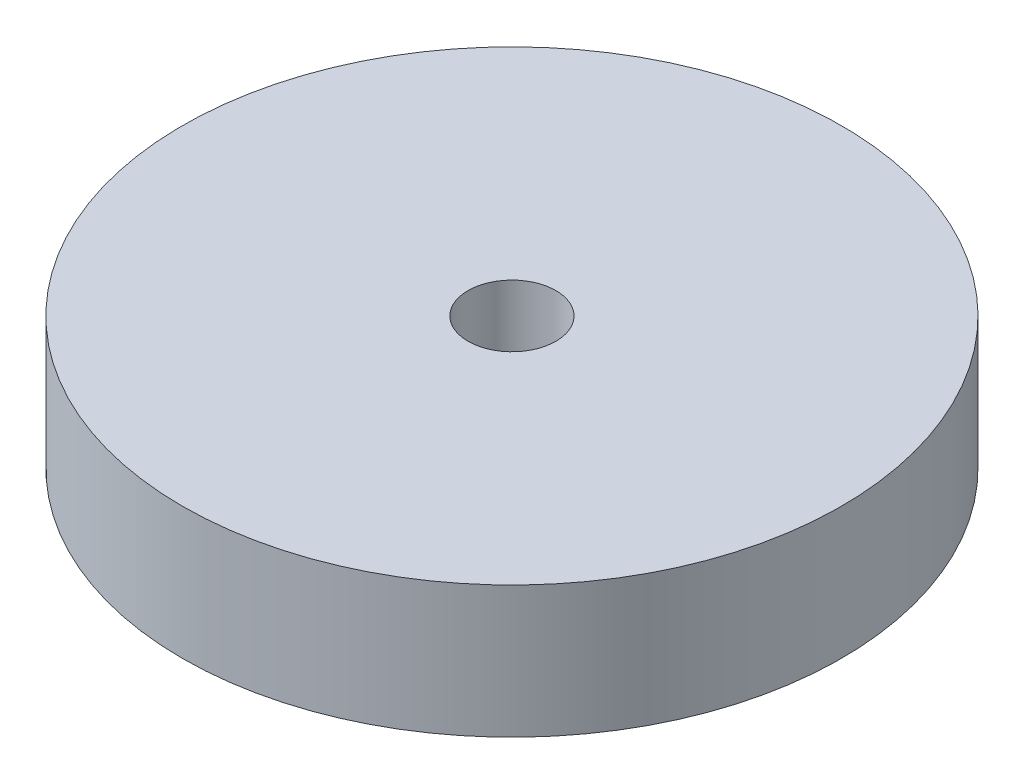
ISO-10303-21;
HEADER;
FILE_DESCRIPTION(('STEP AP214'),'2;1');
FILE_NAME('part.step','',(''),(''),'','','');
FILE_SCHEMA(('AUTOMOTIVE_DESIGN { 1 0 10303 214 1 1 1 1 }'));
ENDSEC;
DATA;
#1=APPLICATION_CONTEXT('core data for automotive mechanical design processes');
#2=APPLICATION_PROTOCOL_DEFINITION('international standard','automotive_design',2000,#1);
#3=PRODUCT_CONTEXT('',#1,'mechanical');
#4=PRODUCT('Part','Part','',(#3));
#5=PRODUCT_RELATED_PRODUCT_CATEGORY('part','',(#4));
#6=PRODUCT_DEFINITION_FORMATION('','',#4);
#7=PRODUCT_DEFINITION_CONTEXT('part definition',#1,'design');
#8=PRODUCT_DEFINITION('design','',#6,#7);
#9=PRODUCT_DEFINITION_SHAPE('','',#8);
#10=(LENGTH_UNIT() NAMED_UNIT(*) SI_UNIT(.MILLI.,.METRE.));
#11=(NAMED_UNIT(*) PLANE_ANGLE_UNIT() SI_UNIT($,.RADIAN.));
#12=(NAMED_UNIT(*) SI_UNIT($,.STERADIAN.) SOLID_ANGLE_UNIT());
#13=UNCERTAINTY_MEASURE_WITH_UNIT(LENGTH_MEASURE(1.E-05),#10,'distance_accuracy_value','');
#14=(GEOMETRIC_REPRESENTATION_CONTEXT(3) GLOBAL_UNCERTAINTY_ASSIGNED_CONTEXT((#13)) GLOBAL_UNIT_ASSIGNED_CONTEXT((#10,
#11,#12)) REPRESENTATION_CONTEXT('',''));
#15=CARTESIAN_POINT('',(0.,0.,0.));
#16=DIRECTION('',(0.,0.,1.));
#17=DIRECTION('',(1.,0.,0.));
#18=AXIS2_PLACEMENT_3D('',#15,#16,#17);
#19=CARTESIAN_POINT('',(0.,131.165919282511,0.));
#20=DIRECTION('',(0.,-1.,0.));
#21=DIRECTION('',(0.,0.,-1.));
#22=AXIS2_PLACEMENT_3D('',#19,#20,#21);
#23=CYLINDRICAL_SURFACE('',#22,281.25);
#24=CARTESIAN_POINT('',(0.,131.165919282511,0.));
#25=DIRECTION('',(0.,1.,0.));
#26=DIRECTION('',(0.,0.,1.));
#27=AXIS2_PLACEMENT_3D('',#24,#25,#26);
#28=CIRCLE('',#27,281.25);
#29=CARTESIAN_POINT('',(0.,131.165919282511,281.25));
#30=VERTEX_POINT('',#29);
#31=EDGE_CURVE('E11',#30,#30,#28,.T.);
#32=ORIENTED_EDGE('',*,*,#31,.F.);
#33=EDGE_LOOP('',(#32));
#34=FACE_BOUND('',#33,.T.);
#35=CARTESIAN_POINT('',(0.,18.6659192825112,0.));
#36=DIRECTION('',(0.,1.,0.));
#37=DIRECTION('',(0.,0.,1.));
#38=AXIS2_PLACEMENT_3D('',#35,#36,#37);
#39=CIRCLE('',#38,281.25);
#40=CARTESIAN_POINT('',(0.,18.6659192825112,281.25));
#41=VERTEX_POINT('',#40);
#42=EDGE_CURVE('E51',#41,#41,#39,.T.);
#43=ORIENTED_EDGE('',*,*,#42,.T.);
#44=EDGE_LOOP('',(#43));
#45=FACE_BOUND('',#44,.T.);
#46=ADVANCED_FACE('F48',(#34,#45),#23,.T.);
#47=CARTESIAN_POINT('',(0.,131.165919282511,0.));
#48=DIRECTION('',(0.,1.,0.));
#49=DIRECTION('',(0.,0.,1.));
#50=AXIS2_PLACEMENT_3D('',#47,#48,#49);
#51=PLANE('',#50);
#52=CARTESIAN_POINT('',(0.,131.165919282511,0.));
#53=DIRECTION('',(0.,1.,0.));
#54=DIRECTION('',(0.,0.,1.));
#55=AXIS2_PLACEMENT_3D('',#52,#53,#54);
#56=CIRCLE('',#55,37.5);
#57=CARTESIAN_POINT('',(0.,131.165919282511,37.5));
#58=VERTEX_POINT('',#57);
#59=EDGE_CURVE('E65',#58,#58,#56,.T.);
#60=ORIENTED_EDGE('',*,*,#59,.F.);
#61=EDGE_LOOP('',(#60));
#62=FACE_BOUND('',#61,.T.);
#63=ORIENTED_EDGE('',*,*,#31,.T.);
#64=EDGE_LOOP('',(#63));
#65=FACE_BOUND('',#64,.T.);
#66=ADVANCED_FACE('F78',(#62,#65),#51,.T.);
#67=CARTESIAN_POINT('',(0.,18.6659192825112,0.));
#68=DIRECTION('',(0.,1.,0.));
#69=DIRECTION('',(0.,0.,1.));
#70=AXIS2_PLACEMENT_3D('',#67,#68,#69);
#71=PLANE('',#70);
#72=ORIENTED_EDGE('',*,*,#42,.F.);
#73=EDGE_LOOP('',(#72));
#74=FACE_BOUND('',#73,.T.);
#75=ADVANCED_FACE('F73',(#74),#71,.F.);
#76=CARTESIAN_POINT('',(0.,74.9159192825112,0.));
#77=DIRECTION('',(0.,1.,0.));
#78=DIRECTION('',(0.,0.,1.));
#79=AXIS2_PLACEMENT_3D('',#76,#77,#78);
#80=CYLINDRICAL_SURFACE('',#79,37.5);
#81=CARTESIAN_POINT('',(0.,74.9159192825112,0.));
#82=DIRECTION('',(0.,1.,0.));
#83=DIRECTION('',(0.,0.,1.));
#84=AXIS2_PLACEMENT_3D('',#81,#82,#83);
#85=CIRCLE('',#84,37.5);
#86=CARTESIAN_POINT('',(0.,74.9159192825112,37.5));
#87=VERTEX_POINT('',#86);
#88=EDGE_CURVE('E58',#87,#87,#85,.T.);
#89=ORIENTED_EDGE('',*,*,#88,.F.);
#90=EDGE_LOOP('',(#89));
#91=FACE_BOUND('',#90,.T.);
#92=ORIENTED_EDGE('',*,*,#59,.T.);
#93=EDGE_LOOP('',(#92));
#94=FACE_BOUND('',#93,.T.);
#95=ADVANCED_FACE('F75',(#91,#94),#80,.F.);
#96=CARTESIAN_POINT('',(0.,74.9159192825112,0.));
#97=DIRECTION('',(0.,1.,0.));
#98=DIRECTION('',(0.,0.,1.));
#99=AXIS2_PLACEMENT_3D('',#96,#97,#98);
#100=PLANE('',#99);
#101=ORIENTED_EDGE('',*,*,#88,.T.);
#102=EDGE_LOOP('',(#101));
#103=FACE_BOUND('',#102,.T.);
#104=ADVANCED_FACE('F66',(#103),#100,.T.);
#105=CLOSED_SHELL('',(#46,#66,#75,#95,#104));
#106=MANIFOLD_SOLID_BREP('B2',#105);
#107=ADVANCED_BREP_SHAPE_REPRESENTATION('',(#18,#106),#14);
#108=SHAPE_DEFINITION_REPRESENTATION(#9,#107);
ENDSEC;
END-ISO-10303-21;
